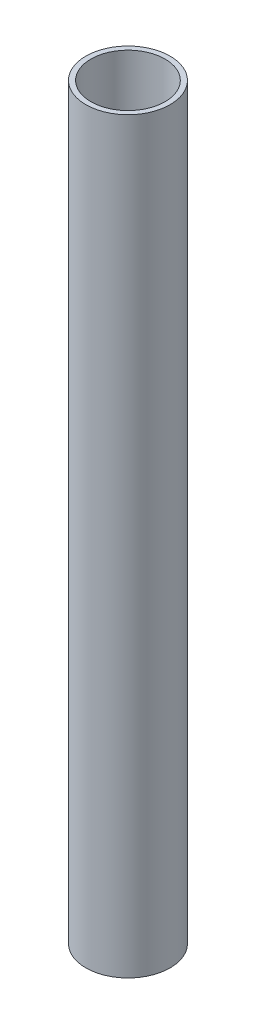
ISO-10303-21;
HEADER;
FILE_DESCRIPTION(('STEP AP214'),'2;1');
FILE_NAME('part.step','',(''),(''),'','','');
FILE_SCHEMA(('AUTOMOTIVE_DESIGN { 1 0 10303 214 1 1 1 1 }'));
ENDSEC;
DATA;
#1=APPLICATION_CONTEXT('core data for automotive mechanical design processes');
#2=APPLICATION_PROTOCOL_DEFINITION('international standard','automotive_design',2000,#1);
#3=PRODUCT_CONTEXT('',#1,'mechanical');
#4=PRODUCT('Part','Part','',(#3));
#5=PRODUCT_RELATED_PRODUCT_CATEGORY('part','',(#4));
#6=PRODUCT_DEFINITION_FORMATION('','',#4);
#7=PRODUCT_DEFINITION_CONTEXT('part definition',#1,'design');
#8=PRODUCT_DEFINITION('design','',#6,#7);
#9=PRODUCT_DEFINITION_SHAPE('','',#8);
#10=(LENGTH_UNIT() NAMED_UNIT(*) SI_UNIT(.MILLI.,.METRE.));
#11=(NAMED_UNIT(*) PLANE_ANGLE_UNIT() SI_UNIT($,.RADIAN.));
#12=(NAMED_UNIT(*) SI_UNIT($,.STERADIAN.) SOLID_ANGLE_UNIT());
#13=UNCERTAINTY_MEASURE_WITH_UNIT(LENGTH_MEASURE(1.E-05),#10,'distance_accuracy_value','');
#14=(GEOMETRIC_REPRESENTATION_CONTEXT(3) GLOBAL_UNCERTAINTY_ASSIGNED_CONTEXT((#13)) GLOBAL_UNIT_ASSIGNED_CONTEXT((#10,
#11,#12)) REPRESENTATION_CONTEXT('',''));
#15=CARTESIAN_POINT('',(0.,0.,0.));
#16=DIRECTION('',(0.,0.,1.));
#17=DIRECTION('',(1.,0.,0.));
#18=AXIS2_PLACEMENT_3D('',#15,#16,#17);
#19=CARTESIAN_POINT('',(0.,222.,0.));
#20=DIRECTION('',(0.,1.,0.));
#21=DIRECTION('',(0.,0.,1.));
#22=AXIS2_PLACEMENT_3D('',#19,#20,#21);
#23=PLANE('',#22);
#24=CARTESIAN_POINT('',(0.,222.,0.));
#25=DIRECTION('',(0.,1.,0.));
#26=DIRECTION('',(0.,0.,1.));
#27=AXIS2_PLACEMENT_3D('',#24,#25,#26);
#28=CIRCLE('',#27,12.5);
#29=CARTESIAN_POINT('',(0.,222.,12.5));
#30=VERTEX_POINT('',#29);
#31=EDGE_CURVE('E10',#30,#30,#28,.T.);
#32=ORIENTED_EDGE('',*,*,#31,.T.);
#33=EDGE_LOOP('',(#32));
#34=FACE_BOUND('',#33,.T.);
#35=CARTESIAN_POINT('',(0.,222.,0.));
#36=DIRECTION('',(0.,1.,0.));
#37=DIRECTION('',(0.,0.,1.));
#38=AXIS2_PLACEMENT_3D('',#35,#36,#37);
#39=CIRCLE('',#38,11.);
#40=CARTESIAN_POINT('',(0.,222.,11.));
#41=VERTEX_POINT('',#40);
#42=EDGE_CURVE('E46',#41,#41,#39,.T.);
#43=ORIENTED_EDGE('',*,*,#42,.F.);
#44=EDGE_LOOP('',(#43));
#45=FACE_BOUND('',#44,.T.);
#46=ADVANCED_FACE('F35',(#34,#45),#23,.T.);
#47=CARTESIAN_POINT('',(0.,0.,0.));
#48=DIRECTION('',(0.,1.,0.));
#49=DIRECTION('',(0.,0.,1.));
#50=AXIS2_PLACEMENT_3D('',#47,#48,#49);
#51=PLANE('',#50);
#52=CARTESIAN_POINT('',(0.,0.,0.));
#53=DIRECTION('',(0.,1.,0.));
#54=DIRECTION('',(0.,0.,1.));
#55=AXIS2_PLACEMENT_3D('',#52,#53,#54);
#56=CIRCLE('',#55,12.5);
#57=CARTESIAN_POINT('',(0.,0.,12.5));
#58=VERTEX_POINT('',#57);
#59=EDGE_CURVE('E39',#58,#58,#56,.T.);
#60=ORIENTED_EDGE('',*,*,#59,.F.);
#61=EDGE_LOOP('',(#60));
#62=FACE_BOUND('',#61,.T.);
#63=CARTESIAN_POINT('',(0.,0.,0.));
#64=DIRECTION('',(0.,1.,0.));
#65=DIRECTION('',(0.,0.,1.));
#66=AXIS2_PLACEMENT_3D('',#63,#64,#65);
#67=CIRCLE('',#66,11.);
#68=CARTESIAN_POINT('',(0.,0.,11.));
#69=VERTEX_POINT('',#68);
#70=EDGE_CURVE('E48',#69,#69,#67,.T.);
#71=ORIENTED_EDGE('',*,*,#70,.T.);
#72=EDGE_LOOP('',(#71));
#73=FACE_BOUND('',#72,.T.);
#74=ADVANCED_FACE('F58',(#62,#73),#51,.F.);
#75=CARTESIAN_POINT('',(0.,222.,0.));
#76=DIRECTION('',(0.,-1.,0.));
#77=DIRECTION('',(0.,0.,-1.));
#78=AXIS2_PLACEMENT_3D('',#75,#76,#77);
#79=CYLINDRICAL_SURFACE('',#78,12.5);
#80=ORIENTED_EDGE('',*,*,#31,.F.);
#81=EDGE_LOOP('',(#80));
#82=FACE_BOUND('',#81,.T.);
#83=ORIENTED_EDGE('',*,*,#59,.T.);
#84=EDGE_LOOP('',(#83));
#85=FACE_BOUND('',#84,.T.);
#86=ADVANCED_FACE('F37',(#82,#85),#79,.T.);
#87=CARTESIAN_POINT('',(0.,222.,0.));
#88=DIRECTION('',(0.,-1.,0.));
#89=DIRECTION('',(0.,0.,-1.));
#90=AXIS2_PLACEMENT_3D('',#87,#88,#89);
#91=CYLINDRICAL_SURFACE('',#90,11.);
#92=ORIENTED_EDGE('',*,*,#42,.T.);
#93=EDGE_LOOP('',(#92));
#94=FACE_BOUND('',#93,.T.);
#95=ORIENTED_EDGE('',*,*,#70,.F.);
#96=EDGE_LOOP('',(#95));
#97=FACE_BOUND('',#96,.T.);
#98=ADVANCED_FACE('F54',(#94,#97),#91,.F.);
#99=CLOSED_SHELL('',(#46,#74,#86,#98));
#100=MANIFOLD_SOLID_BREP('B2',#99);
#101=ADVANCED_BREP_SHAPE_REPRESENTATION('',(#18,#100),#14);
#102=SHAPE_DEFINITION_REPRESENTATION(#9,#101);
ENDSEC;
END-ISO-10303-21;
